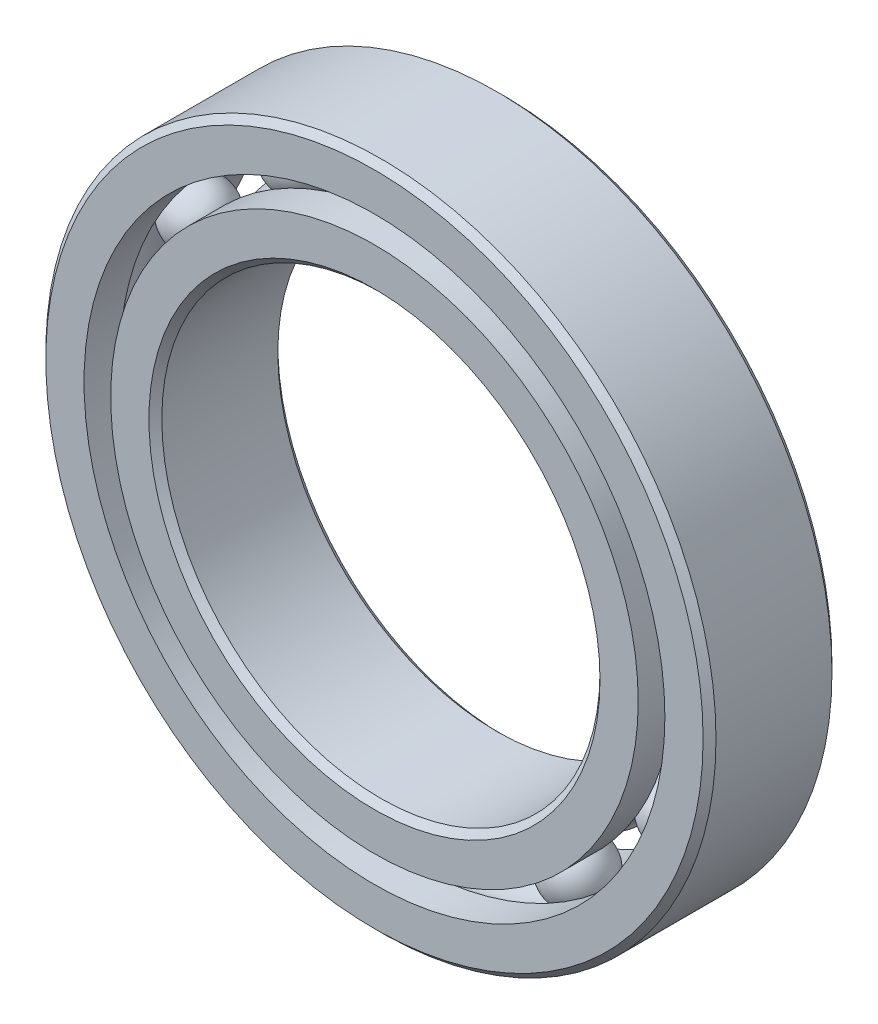
ISO-10303-21;
HEADER;
FILE_DESCRIPTION(('STEP AP214'),'2;1');
FILE_NAME('part.step','',(''),(''),'','','');
FILE_SCHEMA(('AUTOMOTIVE_DESIGN { 1 0 10303 214 1 1 1 1 }'));
ENDSEC;
DATA;
#1=APPLICATION_CONTEXT('core data for automotive mechanical design processes');
#2=APPLICATION_PROTOCOL_DEFINITION('international standard','automotive_design',2000,#1);
#3=PRODUCT_CONTEXT('',#1,'mechanical');
#4=PRODUCT('Part','Part','',(#3));
#5=PRODUCT_RELATED_PRODUCT_CATEGORY('part','',(#4));
#6=PRODUCT_DEFINITION_FORMATION('','',#4);
#7=PRODUCT_DEFINITION_CONTEXT('part definition',#1,'design');
#8=PRODUCT_DEFINITION('design','',#6,#7);
#9=PRODUCT_DEFINITION_SHAPE('','',#8);
#10=(LENGTH_UNIT() NAMED_UNIT(*) SI_UNIT(.MILLI.,.METRE.));
#11=(NAMED_UNIT(*) PLANE_ANGLE_UNIT() SI_UNIT($,.RADIAN.));
#12=(NAMED_UNIT(*) SI_UNIT($,.STERADIAN.) SOLID_ANGLE_UNIT());
#13=UNCERTAINTY_MEASURE_WITH_UNIT(LENGTH_MEASURE(1.E-05),#10,'distance_accuracy_value','');
#14=(GEOMETRIC_REPRESENTATION_CONTEXT(3) GLOBAL_UNCERTAINTY_ASSIGNED_CONTEXT((#13)) GLOBAL_UNIT_ASSIGNED_CONTEXT((#10,
#11,#12)) REPRESENTATION_CONTEXT('',''));
#15=CARTESIAN_POINT('',(0.,0.,0.));
#16=DIRECTION('',(0.,0.,1.));
#17=DIRECTION('',(1.,0.,0.));
#18=AXIS2_PLACEMENT_3D('',#15,#16,#17);
#19=CARTESIAN_POINT('',(-5.37499999999988,9.30977309068278,0.));
#20=DIRECTION('',(0.,0.,1.));
#21=DIRECTION('',(-0.499999999999989,0.866025403784445,0.));
#22=AXIS2_PLACEMENT_3D('',#19,#20,#21);
#23=SPHERICAL_SURFACE('',#22,1.22565713526912);
#24=CARTESIAN_POINT('',(-5.37499999999988,9.30977309068278,1.22565713526912));
#25=VERTEX_POINT('',#24);
#26=VERTEX_LOOP('',#25);
#27=FACE_BOUND('',#26,.T.);
#28=ADVANCED_FACE('F40',(#27),#23,.T.);
#29=CLOSED_SHELL('',(#28));
#30=MANIFOLD_SOLID_BREP('B2',#29);
#31=CARTESIAN_POINT('',(-9.30977309068265,5.37500000000011,0.));
#32=DIRECTION('',(0.,0.,1.));
#33=DIRECTION('',(-0.866025403784433,0.50000000000001,0.));
#34=AXIS2_PLACEMENT_3D('',#31,#32,#33);
#35=SPHERICAL_SURFACE('',#34,1.22565713526912);
#36=CARTESIAN_POINT('',(-9.30977309068265,5.37500000000011,1.22565713526912));
#37=VERTEX_POINT('',#36);
#38=VERTEX_LOOP('',#37);
#39=FACE_BOUND('',#38,.T.);
#40=ADVANCED_FACE('F61',(#39),#35,.T.);
#41=CLOSED_SHELL('',(#40));
#42=MANIFOLD_SOLID_BREP('B6',#41);
#43=CARTESIAN_POINT('',(-10.75,1.12600273177691E-13,0.));
#44=DIRECTION('',(0.,0.,1.));
#45=DIRECTION('',(-1.,0.,0.));
#46=AXIS2_PLACEMENT_3D('',#43,#44,#45);
#47=SPHERICAL_SURFACE('',#46,1.22565713526912);
#48=CARTESIAN_POINT('',(-10.75,1.12600273177691E-13,1.22565713526912));
#49=VERTEX_POINT('',#48);
#50=VERTEX_LOOP('',#49);
#51=FACE_BOUND('',#50,.T.);
#52=ADVANCED_FACE('F82',(#51),#47,.T.);
#53=CLOSED_SHELL('',(#52));
#54=MANIFOLD_SOLID_BREP('B36',#53);
#55=CARTESIAN_POINT('',(-9.30977309068276,-5.37499999999991,0.));
#56=DIRECTION('',(0.,0.,1.));
#57=DIRECTION('',(-0.866025403784443,-0.499999999999992,0.));
#58=AXIS2_PLACEMENT_3D('',#55,#56,#57);
#59=SPHERICAL_SURFACE('',#58,1.22565713526912);
#60=CARTESIAN_POINT('',(-9.30977309068276,-5.37499999999991,1.22565713526912));
#61=VERTEX_POINT('',#60);
#62=VERTEX_LOOP('',#61);
#63=FACE_BOUND('',#62,.T.);
#64=ADVANCED_FACE('F103',(#63),#59,.T.);
#65=CLOSED_SHELL('',(#64));
#66=MANIFOLD_SOLID_BREP('B57',#65);
#67=CARTESIAN_POINT('',(-5.37500000000008,-9.30977309068267,0.));
#68=DIRECTION('',(0.,0.,1.));
#69=DIRECTION('',(-0.500000000000007,-0.866025403784435,0.));
#70=AXIS2_PLACEMENT_3D('',#67,#68,#69);
#71=SPHERICAL_SURFACE('',#70,1.22565713526912);
#72=CARTESIAN_POINT('',(-5.37500000000008,-9.30977309068267,1.22565713526912));
#73=VERTEX_POINT('',#72);
#74=VERTEX_LOOP('',#73);
#75=FACE_BOUND('',#74,.T.);
#76=ADVANCED_FACE('F124',(#75),#71,.T.);
#77=CLOSED_SHELL('',(#76));
#78=MANIFOLD_SOLID_BREP('B78',#77);
#79=CARTESIAN_POINT('',(0.,-10.75,0.));
#80=DIRECTION('',(0.,0.,1.));
#81=DIRECTION('',(0.,-1.,0.));
#82=AXIS2_PLACEMENT_3D('',#79,#80,#81);
#83=SPHERICAL_SURFACE('',#82,1.22565713526912);
#84=CARTESIAN_POINT('',(0.,-10.75,1.22565713526912));
#85=VERTEX_POINT('',#84);
#86=VERTEX_LOOP('',#85);
#87=FACE_BOUND('',#86,.T.);
#88=ADVANCED_FACE('F145',(#87),#83,.T.);
#89=CLOSED_SHELL('',(#88));
#90=MANIFOLD_SOLID_BREP('B99',#89);
#91=CARTESIAN_POINT('',(5.37499999999994,-9.30977309068275,0.));
#92=DIRECTION('',(0.,0.,1.));
#93=DIRECTION('',(0.499999999999995,-0.866025403784442,0.));
#94=AXIS2_PLACEMENT_3D('',#91,#92,#93);
#95=SPHERICAL_SURFACE('',#94,1.22565713526912);
#96=CARTESIAN_POINT('',(5.37499999999994,-9.30977309068275,1.22565713526912));
#97=VERTEX_POINT('',#96);
#98=VERTEX_LOOP('',#97);
#99=FACE_BOUND('',#98,.T.);
#100=ADVANCED_FACE('F166',(#99),#95,.T.);
#101=CLOSED_SHELL('',(#100));
#102=MANIFOLD_SOLID_BREP('B120',#101);
#103=CARTESIAN_POINT('',(9.30977309068269,-5.37500000000004,0.));
#104=DIRECTION('',(0.,0.,1.));
#105=DIRECTION('',(0.866025403784436,-0.500000000000004,0.));
#106=AXIS2_PLACEMENT_3D('',#103,#104,#105);
#107=SPHERICAL_SURFACE('',#106,1.22565713526912);
#108=CARTESIAN_POINT('',(9.30977309068269,-5.37500000000004,1.22565713526912));
#109=VERTEX_POINT('',#108);
#110=VERTEX_LOOP('',#109);
#111=FACE_BOUND('',#110,.T.);
#112=ADVANCED_FACE('F187',(#111),#107,.T.);
#113=CLOSED_SHELL('',(#112));
#114=MANIFOLD_SOLID_BREP('B141',#113);
#115=CARTESIAN_POINT('',(10.75,0.,0.));
#116=DIRECTION('',(0.,0.,1.));
#117=DIRECTION('',(1.,0.,0.));
#118=AXIS2_PLACEMENT_3D('',#115,#116,#117);
#119=SPHERICAL_SURFACE('',#118,1.22565713526912);
#120=CARTESIAN_POINT('',(10.75,0.,1.22565713526912));
#121=VERTEX_POINT('',#120);
#122=VERTEX_LOOP('',#121);
#123=FACE_BOUND('',#122,.T.);
#124=ADVANCED_FACE('F208',(#123),#119,.T.);
#125=CLOSED_SHELL('',(#124));
#126=MANIFOLD_SOLID_BREP('B162',#125);
#127=CARTESIAN_POINT('',(9.30977309068273,5.37499999999998,0.));
#128=DIRECTION('',(0.,0.,1.));
#129=DIRECTION('',(0.86602540378444,0.499999999999998,0.));
#130=AXIS2_PLACEMENT_3D('',#127,#128,#129);
#131=SPHERICAL_SURFACE('',#130,1.22565713526912);
#132=CARTESIAN_POINT('',(9.30977309068273,5.37499999999998,1.22565713526912));
#133=VERTEX_POINT('',#132);
#134=VERTEX_LOOP('',#133);
#135=FACE_BOUND('',#134,.T.);
#136=ADVANCED_FACE('F229',(#135),#131,.T.);
#137=CLOSED_SHELL('',(#136));
#138=MANIFOLD_SOLID_BREP('B183',#137);
#139=CARTESIAN_POINT('',(5.37500000000001,9.30977309068271,0.));
#140=DIRECTION('',(0.,0.,1.));
#141=DIRECTION('',(0.500000000000001,0.866025403784438,0.));
#142=AXIS2_PLACEMENT_3D('',#139,#140,#141);
#143=SPHERICAL_SURFACE('',#142,1.22565713526912);
#144=CARTESIAN_POINT('',(5.37500000000001,9.30977309068271,1.22565713526912));
#145=VERTEX_POINT('',#144);
#146=VERTEX_LOOP('',#145);
#147=FACE_BOUND('',#146,.T.);
#148=ADVANCED_FACE('F250',(#147),#143,.T.);
#149=CLOSED_SHELL('',(#148));
#150=MANIFOLD_SOLID_BREP('B204',#149);
#151=CARTESIAN_POINT('',(0.,10.75,0.));
#152=DIRECTION('',(0.,0.,1.));
#153=DIRECTION('',(0.,1.,0.));
#154=AXIS2_PLACEMENT_3D('',#151,#152,#153);
#155=SPHERICAL_SURFACE('',#154,1.22565713526912);
#156=CARTESIAN_POINT('',(0.,10.75,1.22565713526912));
#157=VERTEX_POINT('',#156);
#158=VERTEX_LOOP('',#157);
#159=FACE_BOUND('',#158,.T.);
#160=ADVANCED_FACE('F273',(#159),#155,.T.);
#161=CLOSED_SHELL('',(#160));
#162=MANIFOLD_SOLID_BREP('B225',#161);
#163=CARTESIAN_POINT('',(0.,10.2326340637406,2.5));
#164=DIRECTION('',(0.,0.,-1.));
#165=DIRECTION('',(-1.,0.,0.));
#166=AXIS2_PLACEMENT_3D('',#163,#164,#165);
#167=PLANE('',#166);
#168=CARTESIAN_POINT('',(0.,0.,2.5));
#169=DIRECTION('',(0.,0.,1.));
#170=DIRECTION('',(1.,0.,0.));
#171=AXIS2_PLACEMENT_3D('',#168,#169,#170);
#172=CIRCLE('',#171,8.75);
#173=CARTESIAN_POINT('',(8.75,0.,2.5));
#174=VERTEX_POINT('',#173);
#175=EDGE_CURVE('E321',#174,#174,#172,.T.);
#176=ORIENTED_EDGE('',*,*,#175,.F.);
#177=EDGE_LOOP('',(#176));
#178=FACE_BOUND('',#177,.T.);
#179=CARTESIAN_POINT('',(0.,0.,2.5));
#180=DIRECTION('',(0.,0.,1.));
#181=DIRECTION('',(1.,0.,0.));
#182=AXIS2_PLACEMENT_3D('',#179,#180,#181);
#183=CIRCLE('',#182,10.2326340637406);
#184=CARTESIAN_POINT('',(10.2326340637406,0.,2.5));
#185=VERTEX_POINT('',#184);
#186=EDGE_CURVE('E272',#185,#185,#183,.T.);
#187=ORIENTED_EDGE('',*,*,#186,.T.);
#188=EDGE_LOOP('',(#187));
#189=FACE_BOUND('',#188,.T.);
#190=ADVANCED_FACE('F293',(#178,#189),#167,.F.);
#191=CARTESIAN_POINT('',(0.,0.,2.5));
#192=DIRECTION('',(0.,0.,1.));
#193=DIRECTION('',(1.,0.,0.));
#194=AXIS2_PLACEMENT_3D('',#191,#192,#193);
#195=CYLINDRICAL_SURFACE('',#194,10.2326340637406);
#196=ORIENTED_EDGE('',*,*,#186,.F.);
#197=EDGE_LOOP('',(#196));
#198=FACE_BOUND('',#197,.T.);
#199=CARTESIAN_POINT('',(0.,0.,1.11111111111111));
#200=DIRECTION('',(0.,0.,1.));
#201=DIRECTION('',(1.,0.,0.));
#202=AXIS2_PLACEMENT_3D('',#199,#200,#201);
#203=CIRCLE('',#202,10.2326340637406);
#204=CARTESIAN_POINT('',(10.2326340637406,0.,1.11111111111111));
#205=VERTEX_POINT('',#204);
#206=EDGE_CURVE('E299',#205,#205,#203,.T.);
#207=ORIENTED_EDGE('',*,*,#206,.T.);
#208=EDGE_LOOP('',(#207));
#209=FACE_BOUND('',#208,.T.);
#210=ADVANCED_FACE('F328',(#198,#209),#195,.T.);
#211=CARTESIAN_POINT('',(0.,0.,0.));
#212=DIRECTION('',(0.,0.,1.));
#213=DIRECTION('',(1.,0.,0.));
#214=AXIS2_PLACEMENT_3D('',#211,#212,#213);
#215=TOROIDAL_SURFACE('',#214,10.75,1.22565713526912);
#216=ORIENTED_EDGE('',*,*,#206,.F.);
#217=EDGE_LOOP('',(#216));
#218=FACE_BOUND('',#217,.T.);
#219=CARTESIAN_POINT('',(0.,0.,-1.11111111111111));
#220=DIRECTION('',(0.,0.,1.));
#221=DIRECTION('',(1.,0.,0.));
#222=AXIS2_PLACEMENT_3D('',#219,#220,#221);
#223=CIRCLE('',#222,10.2326340637406);
#224=CARTESIAN_POINT('',(10.2326340637406,0.,-1.11111111111111));
#225=VERTEX_POINT('',#224);
#226=EDGE_CURVE('E303',#225,#225,#223,.T.);
#227=ORIENTED_EDGE('',*,*,#226,.T.);
#228=EDGE_LOOP('',(#227));
#229=FACE_BOUND('',#228,.T.);
#230=ADVANCED_FACE('F332',(#218,#229),#215,.F.);
#231=CARTESIAN_POINT('',(0.,0.,2.5));
#232=DIRECTION('',(0.,0.,1.));
#233=DIRECTION('',(1.,0.,0.));
#234=AXIS2_PLACEMENT_3D('',#231,#232,#233);
#235=CYLINDRICAL_SURFACE('',#234,10.2326340637406);
#236=ORIENTED_EDGE('',*,*,#226,.F.);
#237=EDGE_LOOP('',(#236));
#238=FACE_BOUND('',#237,.T.);
#239=CARTESIAN_POINT('',(0.,0.,-2.5));
#240=DIRECTION('',(0.,0.,1.));
#241=DIRECTION('',(1.,0.,0.));
#242=AXIS2_PLACEMENT_3D('',#239,#240,#241);
#243=CIRCLE('',#242,10.2326340637406);
#244=CARTESIAN_POINT('',(10.2326340637406,0.,-2.5));
#245=VERTEX_POINT('',#244);
#246=EDGE_CURVE('E307',#245,#245,#243,.T.);
#247=ORIENTED_EDGE('',*,*,#246,.T.);
#248=EDGE_LOOP('',(#247));
#249=FACE_BOUND('',#248,.T.);
#250=ADVANCED_FACE('F337',(#238,#249),#235,.T.);
#251=CARTESIAN_POINT('',(0.,8.75,-2.5));
#252=DIRECTION('',(0.,0.,1.));
#253=DIRECTION('',(1.,0.,0.));
#254=AXIS2_PLACEMENT_3D('',#251,#252,#253);
#255=PLANE('',#254);
#256=ORIENTED_EDGE('',*,*,#246,.F.);
#257=EDGE_LOOP('',(#256));
#258=FACE_BOUND('',#257,.T.);
#259=CARTESIAN_POINT('',(0.,0.,-2.5));
#260=DIRECTION('',(0.,0.,1.));
#261=DIRECTION('',(1.,0.,0.));
#262=AXIS2_PLACEMENT_3D('',#259,#260,#261);
#263=CIRCLE('',#262,8.75);
#264=CARTESIAN_POINT('',(8.75,0.,-2.5));
#265=VERTEX_POINT('',#264);
#266=EDGE_CURVE('E312',#265,#265,#263,.T.);
#267=ORIENTED_EDGE('',*,*,#266,.T.);
#268=EDGE_LOOP('',(#267));
#269=FACE_BOUND('',#268,.T.);
#270=ADVANCED_FACE('F343',(#258,#269),#255,.F.);
#271=CARTESIAN_POINT('',(0.,0.,-2.25));
#272=DIRECTION('',(0.,0.,-1.));
#273=DIRECTION('',(-1.,0.,0.));
#274=AXIS2_PLACEMENT_3D('',#271,#272,#273);
#275=CONICAL_SURFACE('',#274,8.5,0.785398163397442);
#276=ORIENTED_EDGE('',*,*,#266,.F.);
#277=EDGE_LOOP('',(#276));
#278=FACE_BOUND('',#277,.T.);
#279=CARTESIAN_POINT('',(0.,0.,-2.25));
#280=DIRECTION('',(0.,0.,1.));
#281=DIRECTION('',(1.,0.,0.));
#282=AXIS2_PLACEMENT_3D('',#279,#280,#281);
#283=CIRCLE('',#282,8.5);
#284=CARTESIAN_POINT('',(8.5,0.,-2.25));
#285=VERTEX_POINT('',#284);
#286=EDGE_CURVE('E315',#285,#285,#283,.T.);
#287=ORIENTED_EDGE('',*,*,#286,.T.);
#288=EDGE_LOOP('',(#287));
#289=FACE_BOUND('',#288,.T.);
#290=ADVANCED_FACE('F347',(#278,#289),#275,.F.);
#291=CARTESIAN_POINT('',(0.,0.,2.5));
#292=DIRECTION('',(0.,0.,1.));
#293=DIRECTION('',(1.,0.,0.));
#294=AXIS2_PLACEMENT_3D('',#291,#292,#293);
#295=CYLINDRICAL_SURFACE('',#294,8.5);
#296=ORIENTED_EDGE('',*,*,#286,.F.);
#297=EDGE_LOOP('',(#296));
#298=FACE_BOUND('',#297,.T.);
#299=CARTESIAN_POINT('',(0.,0.,2.25));
#300=DIRECTION('',(0.,0.,1.));
#301=DIRECTION('',(1.,0.,0.));
#302=AXIS2_PLACEMENT_3D('',#299,#300,#301);
#303=CIRCLE('',#302,8.5);
#304=CARTESIAN_POINT('',(8.5,0.,2.25));
#305=VERTEX_POINT('',#304);
#306=EDGE_CURVE('E318',#305,#305,#303,.T.);
#307=ORIENTED_EDGE('',*,*,#306,.T.);
#308=EDGE_LOOP('',(#307));
#309=FACE_BOUND('',#308,.T.);
#310=ADVANCED_FACE('F351',(#298,#309),#295,.F.);
#311=CARTESIAN_POINT('',(0.,0.,2.5));
#312=DIRECTION('',(0.,0.,1.));
#313=DIRECTION('',(1.,0.,0.));
#314=AXIS2_PLACEMENT_3D('',#311,#312,#313);
#315=CONICAL_SURFACE('',#314,8.75,0.785398163397454);
#316=ORIENTED_EDGE('',*,*,#306,.F.);
#317=EDGE_LOOP('',(#316));
#318=FACE_BOUND('',#317,.T.);
#319=ORIENTED_EDGE('',*,*,#175,.T.);
#320=EDGE_LOOP('',(#319));
#321=FACE_BOUND('',#320,.T.);
#322=ADVANCED_FACE('F325',(#318,#321),#315,.F.);
#323=CLOSED_SHELL('',(#190,#210,#230,#250,#270,#290,#310,#322));
#324=MANIFOLD_SOLID_BREP('B246',#323);
#325=CARTESIAN_POINT('',(0.,0.,2.25));
#326=DIRECTION('',(0.,0.,-1.));
#327=DIRECTION('',(-1.,0.,0.));
#328=AXIS2_PLACEMENT_3D('',#325,#326,#327);
#329=CONICAL_SURFACE('',#328,13.,0.785398163397442);
#330=CARTESIAN_POINT('',(0.,0.,2.5));
#331=DIRECTION('',(0.,0.,1.));
#332=DIRECTION('',(1.,0.,0.));
#333=AXIS2_PLACEMENT_3D('',#330,#331,#332);
#334=CIRCLE('',#333,12.75);
#335=CARTESIAN_POINT('',(12.75,0.,2.5));
#336=VERTEX_POINT('',#335);
#337=EDGE_CURVE('E443',#336,#336,#334,.T.);
#338=ORIENTED_EDGE('',*,*,#337,.F.);
#339=EDGE_LOOP('',(#338));
#340=FACE_BOUND('',#339,.T.);
#341=CARTESIAN_POINT('',(0.,0.,2.25));
#342=DIRECTION('',(0.,0.,1.));
#343=DIRECTION('',(1.,0.,0.));
#344=AXIS2_PLACEMENT_3D('',#341,#342,#343);
#345=CIRCLE('',#344,13.);
#346=CARTESIAN_POINT('',(13.,0.,2.25));
#347=VERTEX_POINT('',#346);
#348=EDGE_CURVE('E292',#347,#347,#345,.T.);
#349=ORIENTED_EDGE('',*,*,#348,.T.);
#350=EDGE_LOOP('',(#349));
#351=FACE_BOUND('',#350,.T.);
#352=ADVANCED_FACE('F415',(#340,#351),#329,.T.);
#353=CARTESIAN_POINT('',(0.,0.,2.5));
#354=DIRECTION('',(0.,0.,1.));
#355=DIRECTION('',(1.,0.,0.));
#356=AXIS2_PLACEMENT_3D('',#353,#354,#355);
#357=CYLINDRICAL_SURFACE('',#356,13.);
#358=ORIENTED_EDGE('',*,*,#348,.F.);
#359=EDGE_LOOP('',(#358));
#360=FACE_BOUND('',#359,.T.);
#361=CARTESIAN_POINT('',(0.,0.,-2.25));
#362=DIRECTION('',(0.,0.,1.));
#363=DIRECTION('',(1.,0.,0.));
#364=AXIS2_PLACEMENT_3D('',#361,#362,#363);
#365=CIRCLE('',#364,13.);
#366=CARTESIAN_POINT('',(13.,0.,-2.25));
#367=VERTEX_POINT('',#366);
#368=EDGE_CURVE('E421',#367,#367,#365,.T.);
#369=ORIENTED_EDGE('',*,*,#368,.T.);
#370=EDGE_LOOP('',(#369));
#371=FACE_BOUND('',#370,.T.);
#372=ADVANCED_FACE('F450',(#360,#371),#357,.T.);
#373=CARTESIAN_POINT('',(0.,0.,-2.5));
#374=DIRECTION('',(0.,0.,1.));
#375=DIRECTION('',(1.,0.,0.));
#376=AXIS2_PLACEMENT_3D('',#373,#374,#375);
#377=CONICAL_SURFACE('',#376,12.75,0.785398163397442);
#378=ORIENTED_EDGE('',*,*,#368,.F.);
#379=EDGE_LOOP('',(#378));
#380=FACE_BOUND('',#379,.T.);
#381=CARTESIAN_POINT('',(0.,0.,-2.5));
#382=DIRECTION('',(0.,0.,1.));
#383=DIRECTION('',(1.,0.,0.));
#384=AXIS2_PLACEMENT_3D('',#381,#382,#383);
#385=CIRCLE('',#384,12.75);
#386=CARTESIAN_POINT('',(12.75,0.,-2.5));
#387=VERTEX_POINT('',#386);
#388=EDGE_CURVE('E425',#387,#387,#385,.T.);
#389=ORIENTED_EDGE('',*,*,#388,.T.);
#390=EDGE_LOOP('',(#389));
#391=FACE_BOUND('',#390,.T.);
#392=ADVANCED_FACE('F454',(#380,#391),#377,.T.);
#393=CARTESIAN_POINT('',(0.,12.75,-2.5));
#394=DIRECTION('',(0.,0.,1.));
#395=DIRECTION('',(1.,0.,0.));
#396=AXIS2_PLACEMENT_3D('',#393,#394,#395);
#397=PLANE('',#396);
#398=ORIENTED_EDGE('',*,*,#388,.F.);
#399=EDGE_LOOP('',(#398));
#400=FACE_BOUND('',#399,.T.);
#401=CARTESIAN_POINT('',(0.,0.,-2.5));
#402=DIRECTION('',(0.,0.,1.));
#403=DIRECTION('',(1.,0.,0.));
#404=AXIS2_PLACEMENT_3D('',#401,#402,#403);
#405=CIRCLE('',#404,11.2673659362594);
#406=CARTESIAN_POINT('',(11.2673659362594,0.,-2.5));
#407=VERTEX_POINT('',#406);
#408=EDGE_CURVE('E429',#407,#407,#405,.T.);
#409=ORIENTED_EDGE('',*,*,#408,.T.);
#410=EDGE_LOOP('',(#409));
#411=FACE_BOUND('',#410,.T.);
#412=ADVANCED_FACE('F459',(#400,#411),#397,.F.);
#413=CARTESIAN_POINT('',(0.,0.,2.5));
#414=DIRECTION('',(0.,0.,1.));
#415=DIRECTION('',(1.,0.,0.));
#416=AXIS2_PLACEMENT_3D('',#413,#414,#415);
#417=CYLINDRICAL_SURFACE('',#416,11.2673659362594);
#418=ORIENTED_EDGE('',*,*,#408,.F.);
#419=EDGE_LOOP('',(#418));
#420=FACE_BOUND('',#419,.T.);
#421=CARTESIAN_POINT('',(0.,0.,-1.11111111111111));
#422=DIRECTION('',(0.,0.,1.));
#423=DIRECTION('',(1.,0.,0.));
#424=AXIS2_PLACEMENT_3D('',#421,#422,#423);
#425=CIRCLE('',#424,11.2673659362594);
#426=CARTESIAN_POINT('',(11.2673659362594,0.,-1.11111111111111));
#427=VERTEX_POINT('',#426);
#428=EDGE_CURVE('E434',#427,#427,#425,.T.);
#429=ORIENTED_EDGE('',*,*,#428,.T.);
#430=EDGE_LOOP('',(#429));
#431=FACE_BOUND('',#430,.T.);
#432=ADVANCED_FACE('F465',(#420,#431),#417,.F.);
#433=CARTESIAN_POINT('',(0.,0.,0.));
#434=DIRECTION('',(0.,0.,1.));
#435=DIRECTION('',(1.,0.,0.));
#436=AXIS2_PLACEMENT_3D('',#433,#434,#435);
#437=TOROIDAL_SURFACE('',#436,10.75,1.22565713526912);
#438=ORIENTED_EDGE('',*,*,#428,.F.);
#439=EDGE_LOOP('',(#438));
#440=FACE_BOUND('',#439,.T.);
#441=CARTESIAN_POINT('',(0.,0.,1.11111111111111));
#442=DIRECTION('',(0.,0.,1.));
#443=DIRECTION('',(1.,0.,0.));
#444=AXIS2_PLACEMENT_3D('',#441,#442,#443);
#445=CIRCLE('',#444,11.2673659362594);
#446=CARTESIAN_POINT('',(11.2673659362594,0.,1.11111111111111));
#447=VERTEX_POINT('',#446);
#448=EDGE_CURVE('E437',#447,#447,#445,.T.);
#449=ORIENTED_EDGE('',*,*,#448,.T.);
#450=EDGE_LOOP('',(#449));
#451=FACE_BOUND('',#450,.T.);
#452=ADVANCED_FACE('F469',(#440,#451),#437,.F.);
#453=CARTESIAN_POINT('',(0.,0.,2.5));
#454=DIRECTION('',(0.,0.,1.));
#455=DIRECTION('',(1.,0.,0.));
#456=AXIS2_PLACEMENT_3D('',#453,#454,#455);
#457=CYLINDRICAL_SURFACE('',#456,11.2673659362594);
#458=ORIENTED_EDGE('',*,*,#448,.F.);
#459=EDGE_LOOP('',(#458));
#460=FACE_BOUND('',#459,.T.);
#461=CARTESIAN_POINT('',(0.,0.,2.5));
#462=DIRECTION('',(0.,0.,1.));
#463=DIRECTION('',(1.,0.,0.));
#464=AXIS2_PLACEMENT_3D('',#461,#462,#463);
#465=CIRCLE('',#464,11.2673659362594);
#466=CARTESIAN_POINT('',(11.2673659362594,0.,2.5));
#467=VERTEX_POINT('',#466);
#468=EDGE_CURVE('E440',#467,#467,#465,.T.);
#469=ORIENTED_EDGE('',*,*,#468,.T.);
#470=EDGE_LOOP('',(#469));
#471=FACE_BOUND('',#470,.T.);
#472=ADVANCED_FACE('F473',(#460,#471),#457,.F.);
#473=CARTESIAN_POINT('',(0.,12.75,2.5));
#474=DIRECTION('',(0.,0.,-1.));
#475=DIRECTION('',(-1.,0.,0.));
#476=AXIS2_PLACEMENT_3D('',#473,#474,#475);
#477=PLANE('',#476);
#478=ORIENTED_EDGE('',*,*,#468,.F.);
#479=EDGE_LOOP('',(#478));
#480=FACE_BOUND('',#479,.T.);
#481=ORIENTED_EDGE('',*,*,#337,.T.);
#482=EDGE_LOOP('',(#481));
#483=FACE_BOUND('',#482,.T.);
#484=ADVANCED_FACE('F447',(#480,#483),#477,.F.);
#485=CLOSED_SHELL('',(#352,#372,#392,#412,#432,#452,#472,#484));
#486=MANIFOLD_SOLID_BREP('B267',#485);
#487=ADVANCED_BREP_SHAPE_REPRESENTATION('',(#18,#30,#42,#54,#66,#78,#90,#102,#114,#126,#138,
#150,#162,#324,#486),#14);
#488=SHAPE_DEFINITION_REPRESENTATION(#9,#487);
ENDSEC;
END-ISO-10303-21;
